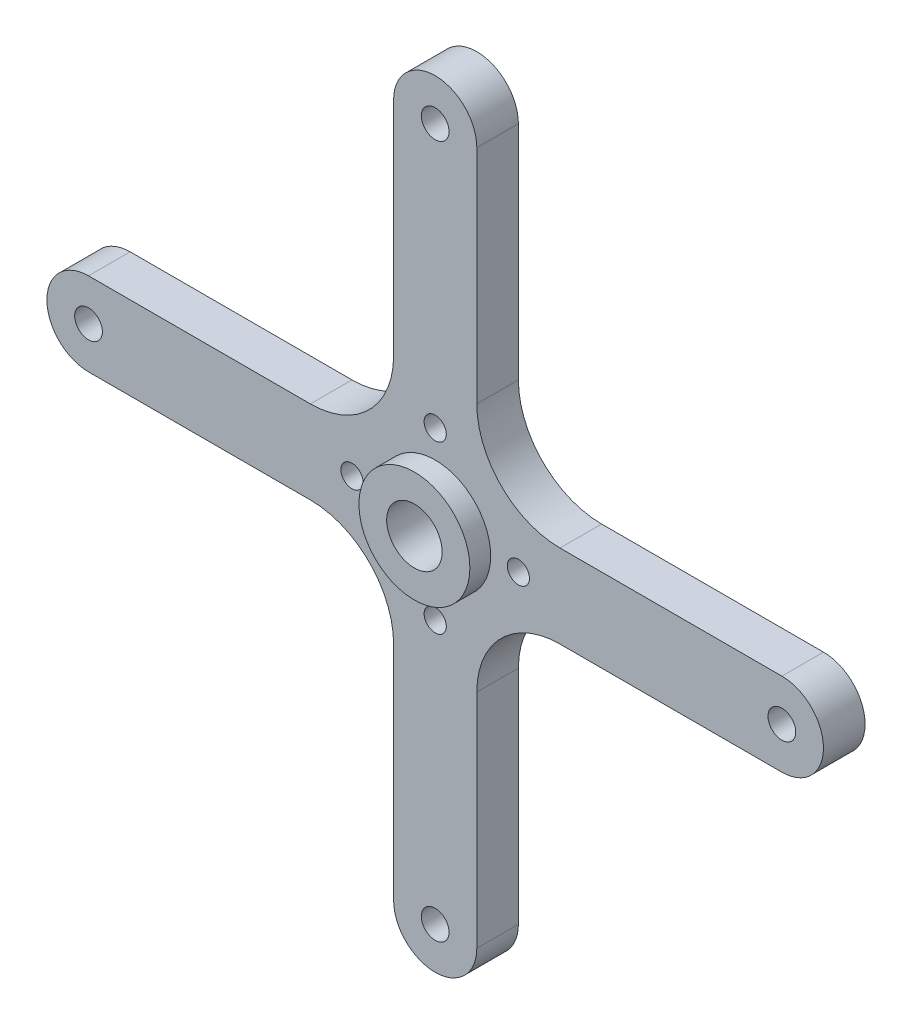
ISO-10303-21;
HEADER;
FILE_DESCRIPTION(('STEP AP214'),'2;1');
FILE_NAME('part.step','',(''),(''),'','','');
FILE_SCHEMA(('AUTOMOTIVE_DESIGN { 1 0 10303 214 1 1 1 1 }'));
ENDSEC;
DATA;
#1=APPLICATION_CONTEXT('core data for automotive mechanical design processes');
#2=APPLICATION_PROTOCOL_DEFINITION('international standard','automotive_design',2000,#1);
#3=PRODUCT_CONTEXT('',#1,'mechanical');
#4=PRODUCT('Part','Part','',(#3));
#5=PRODUCT_RELATED_PRODUCT_CATEGORY('part','',(#4));
#6=PRODUCT_DEFINITION_FORMATION('','',#4);
#7=PRODUCT_DEFINITION_CONTEXT('part definition',#1,'design');
#8=PRODUCT_DEFINITION('design','',#6,#7);
#9=PRODUCT_DEFINITION_SHAPE('','',#8);
#10=(LENGTH_UNIT() NAMED_UNIT(*) SI_UNIT(.MILLI.,.METRE.));
#11=(NAMED_UNIT(*) PLANE_ANGLE_UNIT() SI_UNIT($,.RADIAN.));
#12=(NAMED_UNIT(*) SI_UNIT($,.STERADIAN.) SOLID_ANGLE_UNIT());
#13=UNCERTAINTY_MEASURE_WITH_UNIT(LENGTH_MEASURE(1.E-05),#10,'distance_accuracy_value','');
#14=(GEOMETRIC_REPRESENTATION_CONTEXT(3) GLOBAL_UNCERTAINTY_ASSIGNED_CONTEXT((#13)) GLOBAL_UNIT_ASSIGNED_CONTEXT((#10,
#11,#12)) REPRESENTATION_CONTEXT('',''));
#15=CARTESIAN_POINT('',(0.,0.,0.));
#16=DIRECTION('',(0.,0.,1.));
#17=DIRECTION('',(1.,0.,0.));
#18=AXIS2_PLACEMENT_3D('',#15,#16,#17);
#19=CARTESIAN_POINT('',(0.,0.,3.));
#20=DIRECTION('',(0.,0.,1.));
#21=DIRECTION('',(1.,0.,0.));
#22=AXIS2_PLACEMENT_3D('',#19,#20,#21);
#23=PLANE('',#22);
#24=CARTESIAN_POINT('',(0.,25.,3.));
#25=DIRECTION('',(0.,0.,1.));
#26=DIRECTION('',(1.,0.,0.));
#27=AXIS2_PLACEMENT_3D('',#24,#25,#26);
#28=CIRCLE('',#27,1.);
#29=CARTESIAN_POINT('',(1.,25.,3.));
#30=VERTEX_POINT('',#29);
#31=EDGE_CURVE('E655',#30,#30,#28,.T.);
#32=ORIENTED_EDGE('',*,*,#31,.F.);
#33=EDGE_LOOP('',(#32));
#34=FACE_BOUND('',#33,.T.);
#35=CARTESIAN_POINT('',(25.,0.,3.));
#36=DIRECTION('',(0.,0.,1.));
#37=DIRECTION('',(1.,0.,0.));
#38=AXIS2_PLACEMENT_3D('',#35,#36,#37);
#39=CIRCLE('',#38,1.);
#40=CARTESIAN_POINT('',(26.,0.,3.));
#41=VERTEX_POINT('',#40);
#42=EDGE_CURVE('E657',#41,#41,#39,.T.);
#43=ORIENTED_EDGE('',*,*,#42,.F.);
#44=EDGE_LOOP('',(#43));
#45=FACE_BOUND('',#44,.T.);
#46=CARTESIAN_POINT('',(0.,-25.,3.));
#47=DIRECTION('',(0.,0.,1.));
#48=DIRECTION('',(1.,0.,0.));
#49=AXIS2_PLACEMENT_3D('',#46,#47,#48);
#50=CIRCLE('',#49,1.);
#51=CARTESIAN_POINT('',(1.,-25.,3.));
#52=VERTEX_POINT('',#51);
#53=EDGE_CURVE('E670',#52,#52,#50,.T.);
#54=ORIENTED_EDGE('',*,*,#53,.F.);
#55=EDGE_LOOP('',(#54));
#56=FACE_BOUND('',#55,.T.);
#57=CARTESIAN_POINT('',(-25.,0.,3.));
#58=DIRECTION('',(0.,0.,1.));
#59=DIRECTION('',(1.,0.,0.));
#60=AXIS2_PLACEMENT_3D('',#57,#58,#59);
#61=CIRCLE('',#60,1.);
#62=CARTESIAN_POINT('',(-24.,0.,3.));
#63=VERTEX_POINT('',#62);
#64=EDGE_CURVE('E678',#63,#63,#61,.T.);
#65=ORIENTED_EDGE('',*,*,#64,.F.);
#66=EDGE_LOOP('',(#65));
#67=FACE_BOUND('',#66,.T.);
#68=CARTESIAN_POINT('',(6.,0.,3.));
#69=DIRECTION('',(0.,0.,1.));
#70=DIRECTION('',(1.,0.,0.));
#71=AXIS2_PLACEMENT_3D('',#68,#69,#70);
#72=CIRCLE('',#71,0.800000000000001);
#73=CARTESIAN_POINT('',(6.8,0.,3.));
#74=VERTEX_POINT('',#73);
#75=EDGE_CURVE('E235',#74,#74,#72,.T.);
#76=ORIENTED_EDGE('',*,*,#75,.F.);
#77=EDGE_LOOP('',(#76));
#78=FACE_BOUND('',#77,.T.);
#79=CARTESIAN_POINT('',(0.,6.,3.));
#80=DIRECTION('',(0.,0.,1.));
#81=DIRECTION('',(1.,0.,0.));
#82=AXIS2_PLACEMENT_3D('',#79,#80,#81);
#83=CIRCLE('',#82,0.8);
#84=CARTESIAN_POINT('',(0.799999999999999,6.,3.));
#85=VERTEX_POINT('',#84);
#86=EDGE_CURVE('E231',#85,#85,#83,.T.);
#87=ORIENTED_EDGE('',*,*,#86,.F.);
#88=EDGE_LOOP('',(#87));
#89=FACE_BOUND('',#88,.T.);
#90=CARTESIAN_POINT('',(0.,-6.,3.));
#91=DIRECTION('',(0.,0.,1.));
#92=DIRECTION('',(1.,0.,0.));
#93=AXIS2_PLACEMENT_3D('',#90,#91,#92);
#94=CIRCLE('',#93,0.8);
#95=CARTESIAN_POINT('',(0.800000000000002,-6.,3.));
#96=VERTEX_POINT('',#95);
#97=EDGE_CURVE('E227',#96,#96,#94,.T.);
#98=ORIENTED_EDGE('',*,*,#97,.F.);
#99=EDGE_LOOP('',(#98));
#100=FACE_BOUND('',#99,.T.);
#101=CARTESIAN_POINT('',(-6.,0.,3.));
#102=DIRECTION('',(0.,0.,1.));
#103=DIRECTION('',(1.,0.,0.));
#104=AXIS2_PLACEMENT_3D('',#101,#102,#103);
#105=CIRCLE('',#104,0.800000000000001);
#106=CARTESIAN_POINT('',(-5.2,0.,3.));
#107=VERTEX_POINT('',#106);
#108=EDGE_CURVE('E223',#107,#107,#105,.T.);
#109=ORIENTED_EDGE('',*,*,#108,.F.);
#110=EDGE_LOOP('',(#109));
#111=FACE_BOUND('',#110,.T.);
#112=DIRECTION('',(-1.,0.,0.));
#113=VECTOR('',#112,1.);
#114=CARTESIAN_POINT('',(0.,3.,3.));
#115=LINE('',#114,#113);
#116=CARTESIAN_POINT('',(25.,3.00000000000001,3.));
#117=VERTEX_POINT('',#116);
#118=CARTESIAN_POINT('',(8.99999999999999,3.00000000000001,3.));
#119=VERTEX_POINT('',#118);
#120=EDGE_CURVE('E173',#117,#119,#115,.T.);
#121=ORIENTED_EDGE('',*,*,#120,.T.);
#122=CARTESIAN_POINT('',(8.99999999999999,9.00000000000001,3.));
#123=DIRECTION('',(0.,0.,1.));
#124=DIRECTION('',(1.,0.,0.));
#125=AXIS2_PLACEMENT_3D('',#122,#123,#124);
#126=CIRCLE('',#125,6.);
#127=CARTESIAN_POINT('',(2.99999999999999,9.00000000000001,3.));
#128=VERTEX_POINT('',#127);
#129=EDGE_CURVE('E11',#119,#128,#126,.F.);
#130=ORIENTED_EDGE('',*,*,#129,.T.);
#131=DIRECTION('',(0.,1.,0.));
#132=VECTOR('',#131,1.);
#133=CARTESIAN_POINT('',(2.99999999999999,0.,3.));
#134=LINE('',#133,#132);
#135=CARTESIAN_POINT('',(2.99999999999999,25.,3.));
#136=VERTEX_POINT('',#135);
#137=EDGE_CURVE('E161',#128,#136,#134,.T.);
#138=ORIENTED_EDGE('',*,*,#137,.T.);
#139=CARTESIAN_POINT('',(0.,25.,3.));
#140=DIRECTION('',(0.,0.,1.));
#141=DIRECTION('',(1.,0.,0.));
#142=AXIS2_PLACEMENT_3D('',#139,#140,#141);
#143=CIRCLE('',#142,3.);
#144=CARTESIAN_POINT('',(-3.00000000000001,25.,3.));
#145=VERTEX_POINT('',#144);
#146=EDGE_CURVE('E166',#136,#145,#143,.T.);
#147=ORIENTED_EDGE('',*,*,#146,.T.);
#148=DIRECTION('',(0.,1.,0.));
#149=VECTOR('',#148,1.);
#150=CARTESIAN_POINT('',(-3.00000000000001,0.,3.));
#151=LINE('',#150,#149);
#152=CARTESIAN_POINT('',(-3.00000000000001,9.,3.));
#153=VERTEX_POINT('',#152);
#154=EDGE_CURVE('E189',#153,#145,#151,.T.);
#155=ORIENTED_EDGE('',*,*,#154,.F.);
#156=CARTESIAN_POINT('',(-9.00000000000001,9.,3.));
#157=DIRECTION('',(0.,0.,1.));
#158=DIRECTION('',(1.,0.,0.));
#159=AXIS2_PLACEMENT_3D('',#156,#157,#158);
#160=CIRCLE('',#159,6.);
#161=CARTESIAN_POINT('',(-9.00000000000001,3.,3.));
#162=VERTEX_POINT('',#161);
#163=EDGE_CURVE('E347',#153,#162,#160,.F.);
#164=ORIENTED_EDGE('',*,*,#163,.T.);
#165=DIRECTION('',(-1.,0.,0.));
#166=VECTOR('',#165,1.);
#167=CARTESIAN_POINT('',(0.,3.,3.));
#168=LINE('',#167,#166);
#169=CARTESIAN_POINT('',(-25.,3.,3.));
#170=VERTEX_POINT('',#169);
#171=EDGE_CURVE('E192',#162,#170,#168,.T.);
#172=ORIENTED_EDGE('',*,*,#171,.T.);
#173=CARTESIAN_POINT('',(-25.,0.,3.));
#174=DIRECTION('',(0.,0.,1.));
#175=DIRECTION('',(1.,0.,0.));
#176=AXIS2_PLACEMENT_3D('',#173,#174,#175);
#177=CIRCLE('',#176,3.);
#178=CARTESIAN_POINT('',(-25.,-3.,3.));
#179=VERTEX_POINT('',#178);
#180=EDGE_CURVE('E198',#170,#179,#177,.T.);
#181=ORIENTED_EDGE('',*,*,#180,.T.);
#182=DIRECTION('',(-1.,0.,0.));
#183=VECTOR('',#182,1.);
#184=CARTESIAN_POINT('',(0.,-3.,3.));
#185=LINE('',#184,#183);
#186=CARTESIAN_POINT('',(-9.00000000000001,-3.,3.));
#187=VERTEX_POINT('',#186);
#188=EDGE_CURVE('E202',#187,#179,#185,.T.);
#189=ORIENTED_EDGE('',*,*,#188,.F.);
#190=CARTESIAN_POINT('',(-9.00000000000001,-9.,3.));
#191=DIRECTION('',(0.,0.,1.));
#192=DIRECTION('',(1.,0.,0.));
#193=AXIS2_PLACEMENT_3D('',#190,#191,#192);
#194=CIRCLE('',#193,6.);
#195=CARTESIAN_POINT('',(-3.00000000000001,-9.,3.));
#196=VERTEX_POINT('',#195);
#197=EDGE_CURVE('E353',#187,#196,#194,.F.);
#198=ORIENTED_EDGE('',*,*,#197,.T.);
#199=DIRECTION('',(0.,1.,0.));
#200=VECTOR('',#199,1.);
#201=CARTESIAN_POINT('',(-3.00000000000001,0.,3.));
#202=LINE('',#201,#200);
#203=CARTESIAN_POINT('',(-3.00000000000001,-25.,3.));
#204=VERTEX_POINT('',#203);
#205=EDGE_CURVE('E205',#204,#196,#202,.T.);
#206=ORIENTED_EDGE('',*,*,#205,.F.);
#207=CARTESIAN_POINT('',(0.,-25.,3.));
#208=DIRECTION('',(0.,0.,1.));
#209=DIRECTION('',(1.,0.,0.));
#210=AXIS2_PLACEMENT_3D('',#207,#208,#209);
#211=CIRCLE('',#210,3.);
#212=CARTESIAN_POINT('',(2.99999999999999,-25.,3.));
#213=VERTEX_POINT('',#212);
#214=EDGE_CURVE('E209',#204,#213,#211,.T.);
#215=ORIENTED_EDGE('',*,*,#214,.T.);
#216=DIRECTION('',(0.,1.,0.));
#217=VECTOR('',#216,1.);
#218=CARTESIAN_POINT('',(2.99999999999999,0.,3.));
#219=LINE('',#218,#217);
#220=CARTESIAN_POINT('',(2.99999999999999,-8.99999999999999,3.));
#221=VERTEX_POINT('',#220);
#222=EDGE_CURVE('E212',#213,#221,#219,.T.);
#223=ORIENTED_EDGE('',*,*,#222,.T.);
#224=CARTESIAN_POINT('',(8.99999999999999,-8.99999999999999,3.));
#225=DIRECTION('',(0.,0.,1.));
#226=DIRECTION('',(1.,0.,0.));
#227=AXIS2_PLACEMENT_3D('',#224,#225,#226);
#228=CIRCLE('',#227,6.);
#229=CARTESIAN_POINT('',(8.99999999999999,-2.99999999999999,3.));
#230=VERTEX_POINT('',#229);
#231=EDGE_CURVE('E359',#221,#230,#228,.F.);
#232=ORIENTED_EDGE('',*,*,#231,.T.);
#233=DIRECTION('',(-1.,0.,0.));
#234=VECTOR('',#233,1.);
#235=CARTESIAN_POINT('',(0.,-3.,3.));
#236=LINE('',#235,#234);
#237=CARTESIAN_POINT('',(25.,-2.99999999999999,3.));
#238=VERTEX_POINT('',#237);
#239=EDGE_CURVE('E216',#238,#230,#236,.T.);
#240=ORIENTED_EDGE('',*,*,#239,.F.);
#241=CARTESIAN_POINT('',(25.,0.,3.));
#242=DIRECTION('',(0.,0.,1.));
#243=DIRECTION('',(1.,0.,0.));
#244=AXIS2_PLACEMENT_3D('',#241,#242,#243);
#245=CIRCLE('',#244,3.);
#246=EDGE_CURVE('E220',#238,#117,#245,.T.);
#247=ORIENTED_EDGE('',*,*,#246,.T.);
#248=EDGE_LOOP('',(#121,#130,#138,#147,#155,#164,#172,#181,#189,#198,#206,#215,#223,#232,#240,#247));
#249=FACE_BOUND('',#248,.T.);
#250=CARTESIAN_POINT('',(0.,0.,3.));
#251=DIRECTION('',(0.,0.,1.));
#252=DIRECTION('',(1.,0.,0.));
#253=AXIS2_PLACEMENT_3D('',#250,#251,#252);
#254=CIRCLE('',#253,4.);
#255=CARTESIAN_POINT('',(4.,0.,3.));
#256=VERTEX_POINT('',#255);
#257=EDGE_CURVE('E689',#256,#256,#254,.T.);
#258=ORIENTED_EDGE('',*,*,#257,.F.);
#259=EDGE_LOOP('',(#258));
#260=FACE_BOUND('',#259,.T.);
#261=ADVANCED_FACE('F47',(#34,#45,#56,#67,#78,#89,#100,#111,#249,#260),#23,.T.);
#262=CARTESIAN_POINT('',(0.,3.,3.));
#263=DIRECTION('',(0.,-1.,0.));
#264=DIRECTION('',(1.,0.,0.));
#265=AXIS2_PLACEMENT_3D('',#262,#263,#264);
#266=PLANE('',#265);
#267=DIRECTION('',(-1.,0.,0.));
#268=VECTOR('',#267,1.);
#269=CARTESIAN_POINT('',(0.,3.,0.));
#270=LINE('',#269,#268);
#271=CARTESIAN_POINT('',(25.,3.00000000000001,0.));
#272=VERTEX_POINT('',#271);
#273=CARTESIAN_POINT('',(8.99999999999999,3.00000000000001,0.));
#274=VERTEX_POINT('',#273);
#275=EDGE_CURVE('E240',#272,#274,#270,.T.);
#276=ORIENTED_EDGE('',*,*,#275,.T.);
#277=DIRECTION('',(0.,0.,-1.));
#278=VECTOR('',#277,1.);
#279=CARTESIAN_POINT('',(8.99999999999999,3.00000000000001,3.));
#280=LINE('',#279,#278);
#281=EDGE_CURVE('E63',#274,#119,#280,.F.);
#282=ORIENTED_EDGE('',*,*,#281,.T.);
#283=ORIENTED_EDGE('',*,*,#120,.F.);
#284=DIRECTION('',(0.,0.,-1.));
#285=VECTOR('',#284,1.);
#286=CARTESIAN_POINT('',(25.,3.00000000000001,3.));
#287=LINE('',#286,#285);
#288=EDGE_CURVE('E239',#117,#272,#287,.T.);
#289=ORIENTED_EDGE('',*,*,#288,.T.);
#290=EDGE_LOOP('',(#276,#282,#283,#289));
#291=FACE_BOUND('',#290,.T.);
#292=ADVANCED_FACE('F425',(#291),#266,.F.);
#293=CARTESIAN_POINT('',(2.99999999999999,0.,3.));
#294=DIRECTION('',(-1.,0.,0.));
#295=DIRECTION('',(0.,-1.,0.));
#296=AXIS2_PLACEMENT_3D('',#293,#294,#295);
#297=PLANE('',#296);
#298=ORIENTED_EDGE('',*,*,#137,.F.);
#299=DIRECTION('',(0.,0.,-1.));
#300=VECTOR('',#299,1.);
#301=CARTESIAN_POINT('',(2.99999999999999,9.00000000000001,0.));
#302=LINE('',#301,#300);
#303=CARTESIAN_POINT('',(2.99999999999999,9.00000000000001,0.));
#304=VERTEX_POINT('',#303);
#305=EDGE_CURVE('E339',#128,#304,#302,.T.);
#306=ORIENTED_EDGE('',*,*,#305,.T.);
#307=DIRECTION('',(0.,1.,0.));
#308=VECTOR('',#307,1.);
#309=CARTESIAN_POINT('',(2.99999999999999,0.,0.));
#310=LINE('',#309,#308);
#311=CARTESIAN_POINT('',(2.99999999999999,25.,0.));
#312=VERTEX_POINT('',#311);
#313=EDGE_CURVE('E178',#304,#312,#310,.T.);
#314=ORIENTED_EDGE('',*,*,#313,.T.);
#315=DIRECTION('',(0.,0.,-1.));
#316=VECTOR('',#315,1.);
#317=CARTESIAN_POINT('',(2.99999999999999,25.,3.));
#318=LINE('',#317,#316);
#319=EDGE_CURVE('E176',#136,#312,#318,.T.);
#320=ORIENTED_EDGE('',*,*,#319,.F.);
#321=EDGE_LOOP('',(#298,#306,#314,#320));
#322=FACE_BOUND('',#321,.T.);
#323=ADVANCED_FACE('F177',(#322),#297,.F.);
#324=CARTESIAN_POINT('',(0.,25.,3.));
#325=DIRECTION('',(0.,0.,-1.));
#326=DIRECTION('',(-1.,0.,0.));
#327=AXIS2_PLACEMENT_3D('',#324,#325,#326);
#328=CYLINDRICAL_SURFACE('',#327,3.);
#329=CARTESIAN_POINT('',(0.,25.,0.));
#330=DIRECTION('',(0.,0.,1.));
#331=DIRECTION('',(1.,0.,0.));
#332=AXIS2_PLACEMENT_3D('',#329,#330,#331);
#333=CIRCLE('',#332,3.);
#334=CARTESIAN_POINT('',(-3.00000000000001,25.,0.));
#335=VERTEX_POINT('',#334);
#336=EDGE_CURVE('E246',#312,#335,#333,.T.);
#337=ORIENTED_EDGE('',*,*,#336,.T.);
#338=DIRECTION('',(0.,0.,-1.));
#339=VECTOR('',#338,1.);
#340=CARTESIAN_POINT('',(-3.00000000000001,25.,3.));
#341=LINE('',#340,#339);
#342=EDGE_CURVE('E184',#145,#335,#341,.T.);
#343=ORIENTED_EDGE('',*,*,#342,.F.);
#344=ORIENTED_EDGE('',*,*,#146,.F.);
#345=ORIENTED_EDGE('',*,*,#319,.T.);
#346=EDGE_LOOP('',(#337,#343,#344,#345));
#347=FACE_BOUND('',#346,.T.);
#348=ADVANCED_FACE('F186',(#347),#328,.T.);
#349=CARTESIAN_POINT('',(-3.00000000000001,0.,3.));
#350=DIRECTION('',(-1.,0.,0.));
#351=DIRECTION('',(0.,-1.,0.));
#352=AXIS2_PLACEMENT_3D('',#349,#350,#351);
#353=PLANE('',#352);
#354=DIRECTION('',(0.,1.,0.));
#355=VECTOR('',#354,1.);
#356=CARTESIAN_POINT('',(-3.00000000000001,0.,0.));
#357=LINE('',#356,#355);
#358=CARTESIAN_POINT('',(-3.00000000000001,9.,0.));
#359=VERTEX_POINT('',#358);
#360=EDGE_CURVE('E249',#359,#335,#357,.T.);
#361=ORIENTED_EDGE('',*,*,#360,.F.);
#362=DIRECTION('',(0.,0.,-1.));
#363=VECTOR('',#362,1.);
#364=CARTESIAN_POINT('',(-3.00000000000001,9.,3.));
#365=LINE('',#364,#363);
#366=EDGE_CURVE('E322',#359,#153,#365,.F.);
#367=ORIENTED_EDGE('',*,*,#366,.T.);
#368=ORIENTED_EDGE('',*,*,#154,.T.);
#369=ORIENTED_EDGE('',*,*,#342,.T.);
#370=EDGE_LOOP('',(#361,#367,#368,#369));
#371=FACE_BOUND('',#370,.T.);
#372=ADVANCED_FACE('F414',(#371),#353,.T.);
#373=CARTESIAN_POINT('',(0.,3.,3.));
#374=DIRECTION('',(0.,-1.,0.));
#375=DIRECTION('',(1.,0.,0.));
#376=AXIS2_PLACEMENT_3D('',#373,#374,#375);
#377=PLANE('',#376);
#378=ORIENTED_EDGE('',*,*,#171,.F.);
#379=DIRECTION('',(0.,0.,-1.));
#380=VECTOR('',#379,1.);
#381=CARTESIAN_POINT('',(-9.00000000000001,3.,3.));
#382=LINE('',#381,#380);
#383=CARTESIAN_POINT('',(-9.00000000000001,3.,0.));
#384=VERTEX_POINT('',#383);
#385=EDGE_CURVE('E183',#162,#384,#382,.T.);
#386=ORIENTED_EDGE('',*,*,#385,.T.);
#387=DIRECTION('',(-1.,0.,0.));
#388=VECTOR('',#387,1.);
#389=CARTESIAN_POINT('',(0.,3.,0.));
#390=LINE('',#389,#388);
#391=CARTESIAN_POINT('',(-25.,3.,0.));
#392=VERTEX_POINT('',#391);
#393=EDGE_CURVE('E252',#384,#392,#390,.T.);
#394=ORIENTED_EDGE('',*,*,#393,.T.);
#395=DIRECTION('',(0.,0.,-1.));
#396=VECTOR('',#395,1.);
#397=CARTESIAN_POINT('',(-25.,3.,3.));
#398=LINE('',#397,#396);
#399=EDGE_CURVE('E313',#170,#392,#398,.T.);
#400=ORIENTED_EDGE('',*,*,#399,.F.);
#401=EDGE_LOOP('',(#378,#386,#394,#400));
#402=FACE_BOUND('',#401,.T.);
#403=ADVANCED_FACE('F407',(#402),#377,.F.);
#404=CARTESIAN_POINT('',(-25.,0.,3.));
#405=DIRECTION('',(0.,0.,-1.));
#406=DIRECTION('',(-1.,0.,0.));
#407=AXIS2_PLACEMENT_3D('',#404,#405,#406);
#408=CYLINDRICAL_SURFACE('',#407,3.);
#409=CARTESIAN_POINT('',(-25.,0.,0.));
#410=DIRECTION('',(0.,0.,1.));
#411=DIRECTION('',(1.,0.,0.));
#412=AXIS2_PLACEMENT_3D('',#409,#410,#411);
#413=CIRCLE('',#412,3.);
#414=CARTESIAN_POINT('',(-25.,-3.,0.));
#415=VERTEX_POINT('',#414);
#416=EDGE_CURVE('E255',#392,#415,#413,.T.);
#417=ORIENTED_EDGE('',*,*,#416,.T.);
#418=DIRECTION('',(0.,0.,-1.));
#419=VECTOR('',#418,1.);
#420=CARTESIAN_POINT('',(-25.,-3.,3.));
#421=LINE('',#420,#419);
#422=EDGE_CURVE('E309',#179,#415,#421,.T.);
#423=ORIENTED_EDGE('',*,*,#422,.F.);
#424=ORIENTED_EDGE('',*,*,#180,.F.);
#425=ORIENTED_EDGE('',*,*,#399,.T.);
#426=EDGE_LOOP('',(#417,#423,#424,#425));
#427=FACE_BOUND('',#426,.T.);
#428=ADVANCED_FACE('F401',(#427),#408,.T.);
#429=CARTESIAN_POINT('',(0.,-3.,3.));
#430=DIRECTION('',(0.,-1.,0.));
#431=DIRECTION('',(1.,0.,0.));
#432=AXIS2_PLACEMENT_3D('',#429,#430,#431);
#433=PLANE('',#432);
#434=DIRECTION('',(-1.,0.,0.));
#435=VECTOR('',#434,1.);
#436=CARTESIAN_POINT('',(0.,-3.,0.));
#437=LINE('',#436,#435);
#438=CARTESIAN_POINT('',(-9.00000000000001,-3.,0.));
#439=VERTEX_POINT('',#438);
#440=EDGE_CURVE('E259',#439,#415,#437,.T.);
#441=ORIENTED_EDGE('',*,*,#440,.F.);
#442=DIRECTION('',(0.,0.,-1.));
#443=VECTOR('',#442,1.);
#444=CARTESIAN_POINT('',(-9.00000000000001,-3.,3.));
#445=LINE('',#444,#443);
#446=EDGE_CURVE('E329',#439,#187,#445,.F.);
#447=ORIENTED_EDGE('',*,*,#446,.T.);
#448=ORIENTED_EDGE('',*,*,#188,.T.);
#449=ORIENTED_EDGE('',*,*,#422,.T.);
#450=EDGE_LOOP('',(#441,#447,#448,#449));
#451=FACE_BOUND('',#450,.T.);
#452=ADVANCED_FACE('F396',(#451),#433,.T.);
#453=CARTESIAN_POINT('',(-3.00000000000001,0.,3.));
#454=DIRECTION('',(-1.,0.,0.));
#455=DIRECTION('',(0.,-1.,0.));
#456=AXIS2_PLACEMENT_3D('',#453,#454,#455);
#457=PLANE('',#456);
#458=ORIENTED_EDGE('',*,*,#205,.T.);
#459=DIRECTION('',(0.,0.,-1.));
#460=VECTOR('',#459,1.);
#461=CARTESIAN_POINT('',(-3.00000000000001,-9.,0.));
#462=LINE('',#461,#460);
#463=CARTESIAN_POINT('',(-3.00000000000001,-9.,0.));
#464=VERTEX_POINT('',#463);
#465=EDGE_CURVE('E325',#196,#464,#462,.T.);
#466=ORIENTED_EDGE('',*,*,#465,.T.);
#467=DIRECTION('',(0.,1.,0.));
#468=VECTOR('',#467,1.);
#469=CARTESIAN_POINT('',(-3.00000000000001,0.,0.));
#470=LINE('',#469,#468);
#471=CARTESIAN_POINT('',(-3.00000000000001,-25.,0.));
#472=VERTEX_POINT('',#471);
#473=EDGE_CURVE('E262',#472,#464,#470,.T.);
#474=ORIENTED_EDGE('',*,*,#473,.F.);
#475=DIRECTION('',(0.,0.,-1.));
#476=VECTOR('',#475,1.);
#477=CARTESIAN_POINT('',(-3.00000000000001,-25.,3.));
#478=LINE('',#477,#476);
#479=EDGE_CURVE('E306',#204,#472,#478,.T.);
#480=ORIENTED_EDGE('',*,*,#479,.F.);
#481=EDGE_LOOP('',(#458,#466,#474,#480));
#482=FACE_BOUND('',#481,.T.);
#483=ADVANCED_FACE('F387',(#482),#457,.T.);
#484=CARTESIAN_POINT('',(0.,-25.,3.));
#485=DIRECTION('',(0.,0.,-1.));
#486=DIRECTION('',(-1.,0.,0.));
#487=AXIS2_PLACEMENT_3D('',#484,#485,#486);
#488=CYLINDRICAL_SURFACE('',#487,3.);
#489=CARTESIAN_POINT('',(0.,-25.,0.));
#490=DIRECTION('',(0.,0.,1.));
#491=DIRECTION('',(1.,0.,0.));
#492=AXIS2_PLACEMENT_3D('',#489,#490,#491);
#493=CIRCLE('',#492,3.);
#494=CARTESIAN_POINT('',(2.99999999999999,-25.,0.));
#495=VERTEX_POINT('',#494);
#496=EDGE_CURVE('E266',#472,#495,#493,.T.);
#497=ORIENTED_EDGE('',*,*,#496,.T.);
#498=DIRECTION('',(0.,0.,-1.));
#499=VECTOR('',#498,1.);
#500=CARTESIAN_POINT('',(2.99999999999999,-25.,3.));
#501=LINE('',#500,#499);
#502=EDGE_CURVE('E302',#213,#495,#501,.T.);
#503=ORIENTED_EDGE('',*,*,#502,.F.);
#504=ORIENTED_EDGE('',*,*,#214,.F.);
#505=ORIENTED_EDGE('',*,*,#479,.T.);
#506=EDGE_LOOP('',(#497,#503,#504,#505));
#507=FACE_BOUND('',#506,.T.);
#508=ADVANCED_FACE('F383',(#507),#488,.T.);
#509=CARTESIAN_POINT('',(2.99999999999999,0.,3.));
#510=DIRECTION('',(-1.,0.,0.));
#511=DIRECTION('',(0.,-1.,0.));
#512=AXIS2_PLACEMENT_3D('',#509,#510,#511);
#513=PLANE('',#512);
#514=DIRECTION('',(0.,1.,0.));
#515=VECTOR('',#514,1.);
#516=CARTESIAN_POINT('',(2.99999999999999,0.,0.));
#517=LINE('',#516,#515);
#518=CARTESIAN_POINT('',(2.99999999999999,-8.99999999999999,0.));
#519=VERTEX_POINT('',#518);
#520=EDGE_CURVE('E269',#495,#519,#517,.T.);
#521=ORIENTED_EDGE('',*,*,#520,.T.);
#522=DIRECTION('',(0.,0.,-1.));
#523=VECTOR('',#522,1.);
#524=CARTESIAN_POINT('',(2.99999999999999,-8.99999999999999,3.));
#525=LINE('',#524,#523);
#526=EDGE_CURVE('E336',#519,#221,#525,.F.);
#527=ORIENTED_EDGE('',*,*,#526,.T.);
#528=ORIENTED_EDGE('',*,*,#222,.F.);
#529=ORIENTED_EDGE('',*,*,#502,.T.);
#530=EDGE_LOOP('',(#521,#527,#528,#529));
#531=FACE_BOUND('',#530,.T.);
#532=ADVANCED_FACE('F379',(#531),#513,.F.);
#533=CARTESIAN_POINT('',(0.,-3.,3.));
#534=DIRECTION('',(0.,-1.,0.));
#535=DIRECTION('',(1.,0.,0.));
#536=AXIS2_PLACEMENT_3D('',#533,#534,#535);
#537=PLANE('',#536);
#538=ORIENTED_EDGE('',*,*,#239,.T.);
#539=DIRECTION('',(0.,0.,-1.));
#540=VECTOR('',#539,1.);
#541=CARTESIAN_POINT('',(8.99999999999999,-2.99999999999999,3.));
#542=LINE('',#541,#540);
#543=CARTESIAN_POINT('',(8.99999999999999,-2.99999999999999,0.));
#544=VERTEX_POINT('',#543);
#545=EDGE_CURVE('E332',#230,#544,#542,.T.);
#546=ORIENTED_EDGE('',*,*,#545,.T.);
#547=DIRECTION('',(-1.,0.,0.));
#548=VECTOR('',#547,1.);
#549=CARTESIAN_POINT('',(0.,-3.,0.));
#550=LINE('',#549,#548);
#551=CARTESIAN_POINT('',(25.,-2.99999999999999,0.));
#552=VERTEX_POINT('',#551);
#553=EDGE_CURVE('E273',#552,#544,#550,.T.);
#554=ORIENTED_EDGE('',*,*,#553,.F.);
#555=DIRECTION('',(0.,0.,-1.));
#556=VECTOR('',#555,1.);
#557=CARTESIAN_POINT('',(25.,-2.99999999999999,3.));
#558=LINE('',#557,#556);
#559=EDGE_CURVE('E299',#238,#552,#558,.T.);
#560=ORIENTED_EDGE('',*,*,#559,.F.);
#561=EDGE_LOOP('',(#538,#546,#554,#560));
#562=FACE_BOUND('',#561,.T.);
#563=ADVANCED_FACE('F369',(#562),#537,.T.);
#564=CARTESIAN_POINT('',(0.,6.,3.));
#565=DIRECTION('',(0.,0.,-1.));
#566=DIRECTION('',(-1.,0.,0.));
#567=AXIS2_PLACEMENT_3D('',#564,#565,#566);
#568=CYLINDRICAL_SURFACE('',#567,0.8);
#569=ORIENTED_EDGE('',*,*,#86,.T.);
#570=EDGE_LOOP('',(#569));
#571=FACE_BOUND('',#570,.T.);
#572=CARTESIAN_POINT('',(0.,6.,0.));
#573=DIRECTION('',(0.,0.,1.));
#574=DIRECTION('',(1.,0.,0.));
#575=AXIS2_PLACEMENT_3D('',#572,#573,#574);
#576=CIRCLE('',#575,0.8);
#577=CARTESIAN_POINT('',(0.799999999999999,6.,0.));
#578=VERTEX_POINT('',#577);
#579=EDGE_CURVE('E288',#578,#578,#576,.T.);
#580=ORIENTED_EDGE('',*,*,#579,.F.);
#581=EDGE_LOOP('',(#580));
#582=FACE_BOUND('',#581,.T.);
#583=ADVANCED_FACE('F447',(#571,#582),#568,.F.);
#584=CARTESIAN_POINT('',(0.,-6.,3.));
#585=DIRECTION('',(0.,0.,-1.));
#586=DIRECTION('',(-1.,0.,0.));
#587=AXIS2_PLACEMENT_3D('',#584,#585,#586);
#588=CYLINDRICAL_SURFACE('',#587,0.8);
#589=ORIENTED_EDGE('',*,*,#97,.T.);
#590=EDGE_LOOP('',(#589));
#591=FACE_BOUND('',#590,.T.);
#592=CARTESIAN_POINT('',(0.,-6.,0.));
#593=DIRECTION('',(0.,0.,1.));
#594=DIRECTION('',(1.,0.,0.));
#595=AXIS2_PLACEMENT_3D('',#592,#593,#594);
#596=CIRCLE('',#595,0.8);
#597=CARTESIAN_POINT('',(0.800000000000002,-6.,0.));
#598=VERTEX_POINT('',#597);
#599=EDGE_CURVE('E284',#598,#598,#596,.T.);
#600=ORIENTED_EDGE('',*,*,#599,.F.);
#601=EDGE_LOOP('',(#600));
#602=FACE_BOUND('',#601,.T.);
#603=ADVANCED_FACE('F450',(#591,#602),#588,.F.);
#604=CARTESIAN_POINT('',(-6.,0.,3.));
#605=DIRECTION('',(0.,0.,-1.));
#606=DIRECTION('',(-1.,0.,0.));
#607=AXIS2_PLACEMENT_3D('',#604,#605,#606);
#608=CYLINDRICAL_SURFACE('',#607,0.800000000000001);
#609=ORIENTED_EDGE('',*,*,#108,.T.);
#610=EDGE_LOOP('',(#609));
#611=FACE_BOUND('',#610,.T.);
#612=CARTESIAN_POINT('',(-6.,0.,0.));
#613=DIRECTION('',(0.,0.,1.));
#614=DIRECTION('',(1.,0.,0.));
#615=AXIS2_PLACEMENT_3D('',#612,#613,#614);
#616=CIRCLE('',#615,0.800000000000001);
#617=CARTESIAN_POINT('',(-5.2,0.,0.));
#618=VERTEX_POINT('',#617);
#619=EDGE_CURVE('E280',#618,#618,#616,.T.);
#620=ORIENTED_EDGE('',*,*,#619,.F.);
#621=EDGE_LOOP('',(#620));
#622=FACE_BOUND('',#621,.T.);
#623=ADVANCED_FACE('F454',(#611,#622),#608,.F.);
#624=CARTESIAN_POINT('',(25.,0.,3.));
#625=DIRECTION('',(0.,0.,-1.));
#626=DIRECTION('',(-1.,0.,0.));
#627=AXIS2_PLACEMENT_3D('',#624,#625,#626);
#628=CYLINDRICAL_SURFACE('',#627,3.);
#629=CARTESIAN_POINT('',(25.,0.,0.));
#630=DIRECTION('',(0.,0.,1.));
#631=DIRECTION('',(1.,0.,0.));
#632=AXIS2_PLACEMENT_3D('',#629,#630,#631);
#633=CIRCLE('',#632,3.);
#634=EDGE_CURVE('E277',#552,#272,#633,.T.);
#635=ORIENTED_EDGE('',*,*,#634,.T.);
#636=ORIENTED_EDGE('',*,*,#288,.F.);
#637=ORIENTED_EDGE('',*,*,#246,.F.);
#638=ORIENTED_EDGE('',*,*,#559,.T.);
#639=EDGE_LOOP('',(#635,#636,#637,#638));
#640=FACE_BOUND('',#639,.T.);
#641=ADVANCED_FACE('F445',(#640),#628,.T.);
#642=CARTESIAN_POINT('',(6.,0.,3.));
#643=DIRECTION('',(0.,0.,-1.));
#644=DIRECTION('',(-1.,0.,0.));
#645=AXIS2_PLACEMENT_3D('',#642,#643,#644);
#646=CYLINDRICAL_SURFACE('',#645,0.800000000000001);
#647=ORIENTED_EDGE('',*,*,#75,.T.);
#648=EDGE_LOOP('',(#647));
#649=FACE_BOUND('',#648,.T.);
#650=CARTESIAN_POINT('',(6.,0.,0.));
#651=DIRECTION('',(0.,0.,1.));
#652=DIRECTION('',(1.,0.,0.));
#653=AXIS2_PLACEMENT_3D('',#650,#651,#652);
#654=CIRCLE('',#653,0.800000000000001);
#655=CARTESIAN_POINT('',(6.8,0.,0.));
#656=VERTEX_POINT('',#655);
#657=EDGE_CURVE('E292',#656,#656,#654,.T.);
#658=ORIENTED_EDGE('',*,*,#657,.F.);
#659=EDGE_LOOP('',(#658));
#660=FACE_BOUND('',#659,.T.);
#661=ADVANCED_FACE('F441',(#649,#660),#646,.F.);
#662=CARTESIAN_POINT('',(0.,0.,0.));
#663=DIRECTION('',(0.,0.,1.));
#664=DIRECTION('',(1.,0.,0.));
#665=AXIS2_PLACEMENT_3D('',#662,#663,#664);
#666=PLANE('',#665);
#667=CARTESIAN_POINT('',(0.,25.,0.));
#668=DIRECTION('',(0.,0.,1.));
#669=DIRECTION('',(1.,0.,0.));
#670=AXIS2_PLACEMENT_3D('',#667,#668,#669);
#671=CIRCLE('',#670,1.);
#672=CARTESIAN_POINT('',(1.,25.,0.));
#673=VERTEX_POINT('',#672);
#674=EDGE_CURVE('E653',#673,#673,#671,.T.);
#675=ORIENTED_EDGE('',*,*,#674,.T.);
#676=EDGE_LOOP('',(#675));
#677=FACE_BOUND('',#676,.T.);
#678=CARTESIAN_POINT('',(25.,0.,0.));
#679=DIRECTION('',(0.,0.,1.));
#680=DIRECTION('',(1.,0.,0.));
#681=AXIS2_PLACEMENT_3D('',#678,#679,#680);
#682=CIRCLE('',#681,1.);
#683=CARTESIAN_POINT('',(26.,0.,0.));
#684=VERTEX_POINT('',#683);
#685=EDGE_CURVE('E664',#684,#684,#682,.T.);
#686=ORIENTED_EDGE('',*,*,#685,.T.);
#687=EDGE_LOOP('',(#686));
#688=FACE_BOUND('',#687,.T.);
#689=CARTESIAN_POINT('',(0.,-25.,0.));
#690=DIRECTION('',(0.,0.,1.));
#691=DIRECTION('',(1.,0.,0.));
#692=AXIS2_PLACEMENT_3D('',#689,#690,#691);
#693=CIRCLE('',#692,1.);
#694=CARTESIAN_POINT('',(1.,-25.,0.));
#695=VERTEX_POINT('',#694);
#696=EDGE_CURVE('E674',#695,#695,#693,.T.);
#697=ORIENTED_EDGE('',*,*,#696,.T.);
#698=EDGE_LOOP('',(#697));
#699=FACE_BOUND('',#698,.T.);
#700=CARTESIAN_POINT('',(-25.,0.,0.));
#701=DIRECTION('',(0.,0.,1.));
#702=DIRECTION('',(1.,0.,0.));
#703=AXIS2_PLACEMENT_3D('',#700,#701,#702);
#704=CIRCLE('',#703,1.);
#705=CARTESIAN_POINT('',(-24.,0.,0.));
#706=VERTEX_POINT('',#705);
#707=EDGE_CURVE('E682',#706,#706,#704,.T.);
#708=ORIENTED_EDGE('',*,*,#707,.T.);
#709=EDGE_LOOP('',(#708));
#710=FACE_BOUND('',#709,.T.);
#711=CARTESIAN_POINT('',(0.,0.,0.));
#712=DIRECTION('',(0.,0.,1.));
#713=DIRECTION('',(1.,0.,0.));
#714=AXIS2_PLACEMENT_3D('',#711,#712,#713);
#715=CIRCLE('',#714,2.);
#716=CARTESIAN_POINT('',(2.,0.,0.));
#717=VERTEX_POINT('',#716);
#718=EDGE_CURVE('E243',#717,#717,#715,.T.);
#719=ORIENTED_EDGE('',*,*,#718,.T.);
#720=EDGE_LOOP('',(#719));
#721=FACE_BOUND('',#720,.T.);
#722=ORIENTED_EDGE('',*,*,#275,.F.);
#723=ORIENTED_EDGE('',*,*,#634,.F.);
#724=ORIENTED_EDGE('',*,*,#553,.T.);
#725=CARTESIAN_POINT('',(8.99999999999999,-8.99999999999999,0.));
#726=DIRECTION('',(0.,0.,1.));
#727=DIRECTION('',(1.,0.,0.));
#728=AXIS2_PLACEMENT_3D('',#725,#726,#727);
#729=CIRCLE('',#728,6.);
#730=EDGE_CURVE('E356',#544,#519,#729,.T.);
#731=ORIENTED_EDGE('',*,*,#730,.T.);
#732=ORIENTED_EDGE('',*,*,#520,.F.);
#733=ORIENTED_EDGE('',*,*,#496,.F.);
#734=ORIENTED_EDGE('',*,*,#473,.T.);
#735=CARTESIAN_POINT('',(-9.00000000000001,-9.,0.));
#736=DIRECTION('',(0.,0.,1.));
#737=DIRECTION('',(1.,0.,0.));
#738=AXIS2_PLACEMENT_3D('',#735,#736,#737);
#739=CIRCLE('',#738,6.);
#740=EDGE_CURVE('E350',#464,#439,#739,.T.);
#741=ORIENTED_EDGE('',*,*,#740,.T.);
#742=ORIENTED_EDGE('',*,*,#440,.T.);
#743=ORIENTED_EDGE('',*,*,#416,.F.);
#744=ORIENTED_EDGE('',*,*,#393,.F.);
#745=CARTESIAN_POINT('',(-9.00000000000001,9.,0.));
#746=DIRECTION('',(0.,0.,1.));
#747=DIRECTION('',(1.,0.,0.));
#748=AXIS2_PLACEMENT_3D('',#745,#746,#747);
#749=CIRCLE('',#748,6.);
#750=EDGE_CURVE('E344',#384,#359,#749,.T.);
#751=ORIENTED_EDGE('',*,*,#750,.T.);
#752=ORIENTED_EDGE('',*,*,#360,.T.);
#753=ORIENTED_EDGE('',*,*,#336,.F.);
#754=ORIENTED_EDGE('',*,*,#313,.F.);
#755=CARTESIAN_POINT('',(8.99999999999999,9.00000000000001,0.));
#756=DIRECTION('',(0.,0.,1.));
#757=DIRECTION('',(1.,0.,0.));
#758=AXIS2_PLACEMENT_3D('',#755,#756,#757);
#759=CIRCLE('',#758,6.);
#760=EDGE_CURVE('E56',#304,#274,#759,.T.);
#761=ORIENTED_EDGE('',*,*,#760,.T.);
#762=EDGE_LOOP('',(#722,#723,#724,#731,#732,#733,#734,#741,#742,#743,#744,#751,#752,#753,#754,#761));
#763=FACE_BOUND('',#762,.T.);
#764=ORIENTED_EDGE('',*,*,#619,.T.);
#765=EDGE_LOOP('',(#764));
#766=FACE_BOUND('',#765,.T.);
#767=ORIENTED_EDGE('',*,*,#599,.T.);
#768=EDGE_LOOP('',(#767));
#769=FACE_BOUND('',#768,.T.);
#770=ORIENTED_EDGE('',*,*,#579,.T.);
#771=EDGE_LOOP('',(#770));
#772=FACE_BOUND('',#771,.T.);
#773=ORIENTED_EDGE('',*,*,#657,.T.);
#774=EDGE_LOOP('',(#773));
#775=FACE_BOUND('',#774,.T.);
#776=ADVANCED_FACE('F374',(#677,#688,#699,#710,#721,#763,#766,#769,#772,#775),#666,.F.);
#777=CARTESIAN_POINT('',(-9.00000000000001,9.,3.));
#778=DIRECTION('',(0.,0.,-1.));
#779=DIRECTION('',(-1.,0.,0.));
#780=AXIS2_PLACEMENT_3D('',#777,#778,#779);
#781=CYLINDRICAL_SURFACE('',#780,6.);
#782=ORIENTED_EDGE('',*,*,#163,.F.);
#783=ORIENTED_EDGE('',*,*,#366,.F.);
#784=ORIENTED_EDGE('',*,*,#750,.F.);
#785=ORIENTED_EDGE('',*,*,#385,.F.);
#786=EDGE_LOOP('',(#782,#783,#784,#785));
#787=FACE_BOUND('',#786,.T.);
#788=ADVANCED_FACE('F411',(#787),#781,.F.);
#789=CARTESIAN_POINT('',(-9.00000000000001,-9.,3.));
#790=DIRECTION('',(0.,0.,1.));
#791=DIRECTION('',(1.,0.,0.));
#792=AXIS2_PLACEMENT_3D('',#789,#790,#791);
#793=CYLINDRICAL_SURFACE('',#792,6.);
#794=ORIENTED_EDGE('',*,*,#197,.F.);
#795=ORIENTED_EDGE('',*,*,#446,.F.);
#796=ORIENTED_EDGE('',*,*,#740,.F.);
#797=ORIENTED_EDGE('',*,*,#465,.F.);
#798=EDGE_LOOP('',(#794,#795,#796,#797));
#799=FACE_BOUND('',#798,.T.);
#800=ADVANCED_FACE('F391',(#799),#793,.F.);
#801=CARTESIAN_POINT('',(8.99999999999999,-8.99999999999999,3.));
#802=DIRECTION('',(0.,0.,-1.));
#803=DIRECTION('',(-1.,0.,0.));
#804=AXIS2_PLACEMENT_3D('',#801,#802,#803);
#805=CYLINDRICAL_SURFACE('',#804,6.);
#806=ORIENTED_EDGE('',*,*,#231,.F.);
#807=ORIENTED_EDGE('',*,*,#526,.F.);
#808=ORIENTED_EDGE('',*,*,#730,.F.);
#809=ORIENTED_EDGE('',*,*,#545,.F.);
#810=EDGE_LOOP('',(#806,#807,#808,#809));
#811=FACE_BOUND('',#810,.T.);
#812=ADVANCED_FACE('F372',(#811),#805,.F.);
#813=CARTESIAN_POINT('',(8.99999999999999,9.00000000000001,3.));
#814=DIRECTION('',(0.,0.,1.));
#815=DIRECTION('',(1.,0.,0.));
#816=AXIS2_PLACEMENT_3D('',#813,#814,#815);
#817=CYLINDRICAL_SURFACE('',#816,6.);
#818=ORIENTED_EDGE('',*,*,#129,.F.);
#819=ORIENTED_EDGE('',*,*,#281,.F.);
#820=ORIENTED_EDGE('',*,*,#760,.F.);
#821=ORIENTED_EDGE('',*,*,#305,.F.);
#822=EDGE_LOOP('',(#818,#819,#820,#821));
#823=FACE_BOUND('',#822,.T.);
#824=ADVANCED_FACE('F49',(#823),#817,.F.);
#825=CARTESIAN_POINT('',(0.,0.,0.));
#826=DIRECTION('',(0.,0.,1.));
#827=DIRECTION('',(1.,0.,0.));
#828=AXIS2_PLACEMENT_3D('',#825,#826,#827);
#829=CYLINDRICAL_SURFACE('',#828,2.);
#830=ORIENTED_EDGE('',*,*,#718,.F.);
#831=EDGE_LOOP('',(#830));
#832=FACE_BOUND('',#831,.T.);
#833=CARTESIAN_POINT('',(0.,0.,4.5));
#834=DIRECTION('',(0.,0.,1.));
#835=DIRECTION('',(1.,0.,0.));
#836=AXIS2_PLACEMENT_3D('',#833,#834,#835);
#837=CIRCLE('',#836,2.);
#838=CARTESIAN_POINT('',(2.,0.,4.5));
#839=VERTEX_POINT('',#838);
#840=EDGE_CURVE('E661',#839,#839,#837,.T.);
#841=ORIENTED_EDGE('',*,*,#840,.T.);
#842=EDGE_LOOP('',(#841));
#843=FACE_BOUND('',#842,.T.);
#844=ADVANCED_FACE('F438',(#832,#843),#829,.F.);
#845=CARTESIAN_POINT('',(0.,0.,4.5));
#846=DIRECTION('',(0.,0.,1.));
#847=DIRECTION('',(1.,0.,0.));
#848=AXIS2_PLACEMENT_3D('',#845,#846,#847);
#849=PLANE('',#848);
#850=CARTESIAN_POINT('',(0.,0.,4.5));
#851=DIRECTION('',(0.,0.,1.));
#852=DIRECTION('',(1.,0.,0.));
#853=AXIS2_PLACEMENT_3D('',#850,#851,#852);
#854=CIRCLE('',#853,4.);
#855=CARTESIAN_POINT('',(4.,0.,4.5));
#856=VERTEX_POINT('',#855);
#857=EDGE_CURVE('E690',#856,#856,#854,.T.);
#858=ORIENTED_EDGE('',*,*,#857,.T.);
#859=EDGE_LOOP('',(#858));
#860=FACE_BOUND('',#859,.T.);
#861=ORIENTED_EDGE('',*,*,#840,.F.);
#862=EDGE_LOOP('',(#861));
#863=FACE_BOUND('',#862,.T.);
#864=ADVANCED_FACE('F590',(#860,#863),#849,.T.);
#865=CARTESIAN_POINT('',(0.,0.,4.5));
#866=DIRECTION('',(0.,0.,-1.));
#867=DIRECTION('',(-1.,0.,0.));
#868=AXIS2_PLACEMENT_3D('',#865,#866,#867);
#869=CYLINDRICAL_SURFACE('',#868,4.);
#870=ORIENTED_EDGE('',*,*,#857,.F.);
#871=EDGE_LOOP('',(#870));
#872=FACE_BOUND('',#871,.T.);
#873=ORIENTED_EDGE('',*,*,#257,.T.);
#874=EDGE_LOOP('',(#873));
#875=FACE_BOUND('',#874,.T.);
#876=ADVANCED_FACE('F597',(#872,#875),#869,.T.);
#877=CARTESIAN_POINT('',(-25.,0.,0.));
#878=DIRECTION('',(0.,0.,1.));
#879=DIRECTION('',(1.,0.,0.));
#880=AXIS2_PLACEMENT_3D('',#877,#878,#879);
#881=CYLINDRICAL_SURFACE('',#880,1.);
#882=ORIENTED_EDGE('',*,*,#707,.F.);
#883=EDGE_LOOP('',(#882));
#884=FACE_BOUND('',#883,.T.);
#885=ORIENTED_EDGE('',*,*,#64,.T.);
#886=EDGE_LOOP('',(#885));
#887=FACE_BOUND('',#886,.T.);
#888=ADVANCED_FACE('F605',(#884,#887),#881,.F.);
#889=CARTESIAN_POINT('',(0.,-25.,0.));
#890=DIRECTION('',(0.,0.,1.));
#891=DIRECTION('',(1.,0.,0.));
#892=AXIS2_PLACEMENT_3D('',#889,#890,#891);
#893=CYLINDRICAL_SURFACE('',#892,1.);
#894=ORIENTED_EDGE('',*,*,#696,.F.);
#895=EDGE_LOOP('',(#894));
#896=FACE_BOUND('',#895,.T.);
#897=ORIENTED_EDGE('',*,*,#53,.T.);
#898=EDGE_LOOP('',(#897));
#899=FACE_BOUND('',#898,.T.);
#900=ADVANCED_FACE('F617',(#896,#899),#893,.F.);
#901=CARTESIAN_POINT('',(25.,0.,0.));
#902=DIRECTION('',(0.,0.,1.));
#903=DIRECTION('',(1.,0.,0.));
#904=AXIS2_PLACEMENT_3D('',#901,#902,#903);
#905=CYLINDRICAL_SURFACE('',#904,1.);
#906=ORIENTED_EDGE('',*,*,#685,.F.);
#907=EDGE_LOOP('',(#906));
#908=FACE_BOUND('',#907,.T.);
#909=ORIENTED_EDGE('',*,*,#42,.T.);
#910=EDGE_LOOP('',(#909));
#911=FACE_BOUND('',#910,.T.);
#912=ADVANCED_FACE('F627',(#908,#911),#905,.F.);
#913=CARTESIAN_POINT('',(0.,25.,0.));
#914=DIRECTION('',(0.,0.,1.));
#915=DIRECTION('',(1.,0.,0.));
#916=AXIS2_PLACEMENT_3D('',#913,#914,#915);
#917=CYLINDRICAL_SURFACE('',#916,1.);
#918=ORIENTED_EDGE('',*,*,#674,.F.);
#919=EDGE_LOOP('',(#918));
#920=FACE_BOUND('',#919,.T.);
#921=ORIENTED_EDGE('',*,*,#31,.T.);
#922=EDGE_LOOP('',(#921));
#923=FACE_BOUND('',#922,.T.);
#924=ADVANCED_FACE('F637',(#920,#923),#917,.F.);
#925=CLOSED_SHELL('',(#261,#292,#323,#348,#372,#403,#428,#452,#483,#508,#532,#563,#583,#603,
#623,#641,#661,#776,#788,#800,#812,#824,#844,#864,#876,#888,#900,#912,#924));
#926=MANIFOLD_SOLID_BREP('B2',#925);
#927=ADVANCED_BREP_SHAPE_REPRESENTATION('',(#18,#926),#14);
#928=SHAPE_DEFINITION_REPRESENTATION(#9,#927);
ENDSEC;
END-ISO-10303-21;
